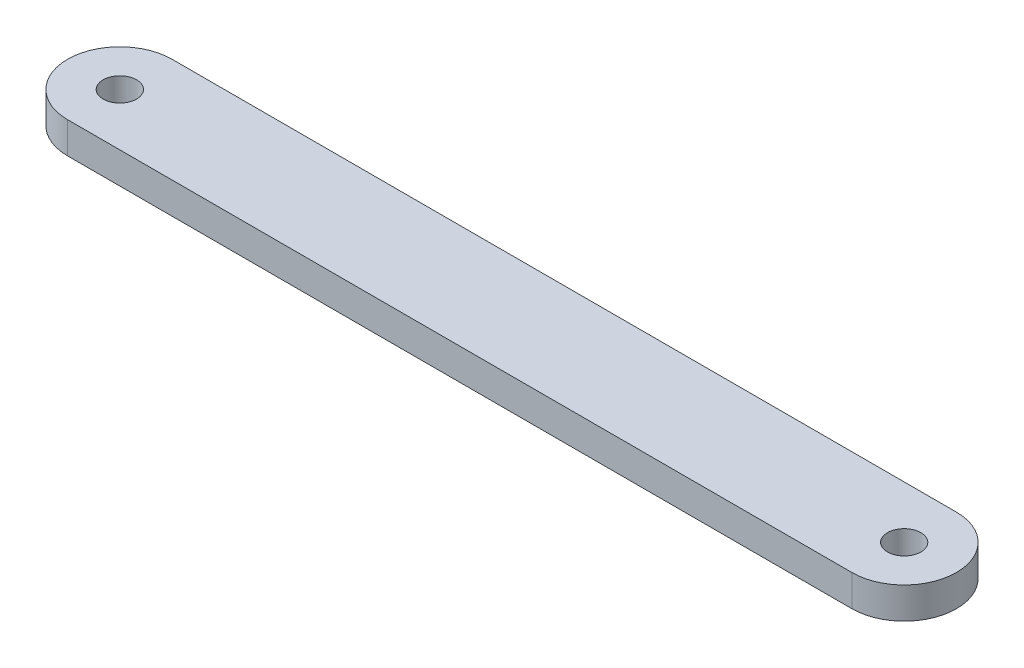
ISO-10303-21;
HEADER;
FILE_DESCRIPTION(('STEP AP214'),'2;1');
FILE_NAME('part.step','',(''),(''),'','','');
FILE_SCHEMA(('AUTOMOTIVE_DESIGN { 1 0 10303 214 1 1 1 1 }'));
ENDSEC;
DATA;
#1=APPLICATION_CONTEXT('core data for automotive mechanical design processes');
#2=APPLICATION_PROTOCOL_DEFINITION('international standard','automotive_design',2000,#1);
#3=PRODUCT_CONTEXT('',#1,'mechanical');
#4=PRODUCT('Part','Part','',(#3));
#5=PRODUCT_RELATED_PRODUCT_CATEGORY('part','',(#4));
#6=PRODUCT_DEFINITION_FORMATION('','',#4);
#7=PRODUCT_DEFINITION_CONTEXT('part definition',#1,'design');
#8=PRODUCT_DEFINITION('design','',#6,#7);
#9=PRODUCT_DEFINITION_SHAPE('','',#8);
#10=(LENGTH_UNIT() NAMED_UNIT(*) SI_UNIT(.MILLI.,.METRE.));
#11=(NAMED_UNIT(*) PLANE_ANGLE_UNIT() SI_UNIT($,.RADIAN.));
#12=(NAMED_UNIT(*) SI_UNIT($,.STERADIAN.) SOLID_ANGLE_UNIT());
#13=UNCERTAINTY_MEASURE_WITH_UNIT(LENGTH_MEASURE(1.E-05),#10,'distance_accuracy_value','');
#14=(GEOMETRIC_REPRESENTATION_CONTEXT(3) GLOBAL_UNCERTAINTY_ASSIGNED_CONTEXT((#13)) GLOBAL_UNIT_ASSIGNED_CONTEXT((#10,
#11,#12)) REPRESENTATION_CONTEXT('',''));
#15=CARTESIAN_POINT('',(0.,0.,0.));
#16=DIRECTION('',(0.,0.,1.));
#17=DIRECTION('',(1.,0.,0.));
#18=AXIS2_PLACEMENT_3D('',#15,#16,#17);
#19=CARTESIAN_POINT('',(75.,3.,0.));
#20=DIRECTION('',(0.,1.,0.));
#21=DIRECTION('',(0.,0.,1.));
#22=AXIS2_PLACEMENT_3D('',#19,#20,#21);
#23=PLANE('',#22);
#24=CARTESIAN_POINT('',(0.,3.,0.));
#25=DIRECTION('',(0.,1.,0.));
#26=DIRECTION('',(0.,0.,1.));
#27=AXIS2_PLACEMENT_3D('',#24,#25,#26);
#28=CIRCLE('',#27,1.6);
#29=CARTESIAN_POINT('',(0.,3.,1.6));
#30=VERTEX_POINT('',#29);
#31=EDGE_CURVE('E112',#30,#30,#28,.T.);
#32=ORIENTED_EDGE('',*,*,#31,.F.);
#33=EDGE_LOOP('',(#32));
#34=FACE_BOUND('',#33,.T.);
#35=CARTESIAN_POINT('',(75.,3.,0.));
#36=DIRECTION('',(0.,1.,0.));
#37=DIRECTION('',(0.,0.,1.));
#38=AXIS2_PLACEMENT_3D('',#35,#36,#37);
#39=CIRCLE('',#38,5.);
#40=CARTESIAN_POINT('',(75.,3.,5.));
#41=VERTEX_POINT('',#40);
#42=CARTESIAN_POINT('',(75.,3.,-5.));
#43=VERTEX_POINT('',#42);
#44=EDGE_CURVE('E92',#41,#43,#39,.T.);
#45=ORIENTED_EDGE('',*,*,#44,.T.);
#46=DIRECTION('',(-1.,0.,0.));
#47=VECTOR('',#46,1.);
#48=CARTESIAN_POINT('',(0.,3.,-5.));
#49=LINE('',#48,#47);
#50=CARTESIAN_POINT('',(0.,3.,-5.));
#51=VERTEX_POINT('',#50);
#52=EDGE_CURVE('E87',#43,#51,#49,.T.);
#53=ORIENTED_EDGE('',*,*,#52,.T.);
#54=CARTESIAN_POINT('',(0.,3.,0.));
#55=DIRECTION('',(0.,1.,0.));
#56=DIRECTION('',(0.,0.,1.));
#57=AXIS2_PLACEMENT_3D('',#54,#55,#56);
#58=CIRCLE('',#57,5.);
#59=CARTESIAN_POINT('',(0.,3.,5.));
#60=VERTEX_POINT('',#59);
#61=EDGE_CURVE('E90',#51,#60,#58,.T.);
#62=ORIENTED_EDGE('',*,*,#61,.T.);
#63=DIRECTION('',(1.,0.,0.));
#64=VECTOR('',#63,1.);
#65=CARTESIAN_POINT('',(0.,3.,5.));
#66=LINE('',#65,#64);
#67=EDGE_CURVE('E57',#60,#41,#66,.T.);
#68=ORIENTED_EDGE('',*,*,#67,.T.);
#69=EDGE_LOOP('',(#45,#53,#62,#68));
#70=FACE_BOUND('',#69,.T.);
#71=CARTESIAN_POINT('',(75.,3.,0.));
#72=DIRECTION('',(0.,1.,0.));
#73=DIRECTION('',(0.,0.,1.));
#74=AXIS2_PLACEMENT_3D('',#71,#72,#73);
#75=CIRCLE('',#74,1.60000000000001);
#76=CARTESIAN_POINT('',(75.,3.,1.60000000000001));
#77=VERTEX_POINT('',#76);
#78=EDGE_CURVE('E134',#77,#77,#75,.T.);
#79=ORIENTED_EDGE('',*,*,#78,.F.);
#80=EDGE_LOOP('',(#79));
#81=FACE_BOUND('',#80,.T.);
#82=ADVANCED_FACE('F39',(#34,#70,#81),#23,.T.);
#83=CARTESIAN_POINT('',(75.,0.,0.));
#84=DIRECTION('',(0.,1.,0.));
#85=DIRECTION('',(0.,0.,1.));
#86=AXIS2_PLACEMENT_3D('',#83,#84,#85);
#87=PLANE('',#86);
#88=CARTESIAN_POINT('',(75.,0.,0.));
#89=DIRECTION('',(0.,1.,0.));
#90=DIRECTION('',(0.,0.,1.));
#91=AXIS2_PLACEMENT_3D('',#88,#89,#90);
#92=CIRCLE('',#91,5.);
#93=CARTESIAN_POINT('',(75.,0.,5.));
#94=VERTEX_POINT('',#93);
#95=CARTESIAN_POINT('',(75.,0.,-5.));
#96=VERTEX_POINT('',#95);
#97=EDGE_CURVE('E108',#94,#96,#92,.T.);
#98=ORIENTED_EDGE('',*,*,#97,.F.);
#99=DIRECTION('',(1.,0.,0.));
#100=VECTOR('',#99,1.);
#101=CARTESIAN_POINT('',(0.,0.,5.));
#102=LINE('',#101,#100);
#103=CARTESIAN_POINT('',(0.,0.,5.));
#104=VERTEX_POINT('',#103);
#105=EDGE_CURVE('E80',#104,#94,#102,.T.);
#106=ORIENTED_EDGE('',*,*,#105,.F.);
#107=CARTESIAN_POINT('',(0.,0.,0.));
#108=DIRECTION('',(0.,1.,0.));
#109=DIRECTION('',(0.,0.,1.));
#110=AXIS2_PLACEMENT_3D('',#107,#108,#109);
#111=CIRCLE('',#110,5.);
#112=CARTESIAN_POINT('',(0.,0.,-5.));
#113=VERTEX_POINT('',#112);
#114=EDGE_CURVE('E74',#113,#104,#111,.T.);
#115=ORIENTED_EDGE('',*,*,#114,.F.);
#116=DIRECTION('',(-1.,0.,0.));
#117=VECTOR('',#116,1.);
#118=CARTESIAN_POINT('',(0.,0.,-5.));
#119=LINE('',#118,#117);
#120=EDGE_CURVE('E97',#96,#113,#119,.T.);
#121=ORIENTED_EDGE('',*,*,#120,.F.);
#122=EDGE_LOOP('',(#98,#106,#115,#121));
#123=FACE_BOUND('',#122,.T.);
#124=CARTESIAN_POINT('',(0.,0.,0.));
#125=DIRECTION('',(0.,1.,0.));
#126=DIRECTION('',(0.,0.,1.));
#127=AXIS2_PLACEMENT_3D('',#124,#125,#126);
#128=CIRCLE('',#127,1.6);
#129=CARTESIAN_POINT('',(0.,0.,1.6));
#130=VERTEX_POINT('',#129);
#131=EDGE_CURVE('E130',#130,#130,#128,.T.);
#132=ORIENTED_EDGE('',*,*,#131,.T.);
#133=EDGE_LOOP('',(#132));
#134=FACE_BOUND('',#133,.T.);
#135=CARTESIAN_POINT('',(75.,0.,0.));
#136=DIRECTION('',(0.,1.,0.));
#137=DIRECTION('',(0.,0.,1.));
#138=AXIS2_PLACEMENT_3D('',#135,#136,#137);
#139=CIRCLE('',#138,1.60000000000001);
#140=CARTESIAN_POINT('',(75.,0.,1.60000000000001));
#141=VERTEX_POINT('',#140);
#142=EDGE_CURVE('E138',#141,#141,#139,.T.);
#143=ORIENTED_EDGE('',*,*,#142,.T.);
#144=EDGE_LOOP('',(#143));
#145=FACE_BOUND('',#144,.T.);
#146=ADVANCED_FACE('F125',(#123,#134,#145),#87,.F.);
#147=CARTESIAN_POINT('',(75.,3.,0.));
#148=DIRECTION('',(0.,-1.,0.));
#149=DIRECTION('',(0.,0.,-1.));
#150=AXIS2_PLACEMENT_3D('',#147,#148,#149);
#151=CYLINDRICAL_SURFACE('',#150,5.);
#152=ORIENTED_EDGE('',*,*,#97,.T.);
#153=DIRECTION('',(0.,-1.,0.));
#154=VECTOR('',#153,1.);
#155=CARTESIAN_POINT('',(75.,3.,-5.));
#156=LINE('',#155,#154);
#157=EDGE_CURVE('E11',#43,#96,#156,.T.);
#158=ORIENTED_EDGE('',*,*,#157,.F.);
#159=ORIENTED_EDGE('',*,*,#44,.F.);
#160=DIRECTION('',(0.,-1.,0.));
#161=VECTOR('',#160,1.);
#162=CARTESIAN_POINT('',(75.,3.,5.));
#163=LINE('',#162,#161);
#164=EDGE_CURVE('E104',#41,#94,#163,.T.);
#165=ORIENTED_EDGE('',*,*,#164,.T.);
#166=EDGE_LOOP('',(#152,#158,#159,#165));
#167=FACE_BOUND('',#166,.T.);
#168=ADVANCED_FACE('F41',(#167),#151,.T.);
#169=CARTESIAN_POINT('',(0.,3.,-5.));
#170=DIRECTION('',(0.,0.,1.));
#171=DIRECTION('',(1.,0.,0.));
#172=AXIS2_PLACEMENT_3D('',#169,#170,#171);
#173=PLANE('',#172);
#174=ORIENTED_EDGE('',*,*,#120,.T.);
#175=DIRECTION('',(0.,-1.,0.));
#176=VECTOR('',#175,1.);
#177=CARTESIAN_POINT('',(0.,3.,-5.));
#178=LINE('',#177,#176);
#179=EDGE_CURVE('E49',#51,#113,#178,.T.);
#180=ORIENTED_EDGE('',*,*,#179,.F.);
#181=ORIENTED_EDGE('',*,*,#52,.F.);
#182=ORIENTED_EDGE('',*,*,#157,.T.);
#183=EDGE_LOOP('',(#174,#180,#181,#182));
#184=FACE_BOUND('',#183,.T.);
#185=ADVANCED_FACE('F96',(#184),#173,.F.);
#186=CARTESIAN_POINT('',(0.,3.,0.));
#187=DIRECTION('',(0.,-1.,0.));
#188=DIRECTION('',(0.,0.,-1.));
#189=AXIS2_PLACEMENT_3D('',#186,#187,#188);
#190=CYLINDRICAL_SURFACE('',#189,5.);
#191=ORIENTED_EDGE('',*,*,#114,.T.);
#192=DIRECTION('',(0.,-1.,0.));
#193=VECTOR('',#192,1.);
#194=CARTESIAN_POINT('',(0.,3.,5.));
#195=LINE('',#194,#193);
#196=EDGE_CURVE('E99',#60,#104,#195,.T.);
#197=ORIENTED_EDGE('',*,*,#196,.F.);
#198=ORIENTED_EDGE('',*,*,#61,.F.);
#199=ORIENTED_EDGE('',*,*,#179,.T.);
#200=EDGE_LOOP('',(#191,#197,#198,#199));
#201=FACE_BOUND('',#200,.T.);
#202=ADVANCED_FACE('F100',(#201),#190,.T.);
#203=CARTESIAN_POINT('',(0.,3.,5.));
#204=DIRECTION('',(0.,0.,-1.));
#205=DIRECTION('',(-1.,0.,0.));
#206=AXIS2_PLACEMENT_3D('',#203,#204,#205);
#207=PLANE('',#206);
#208=ORIENTED_EDGE('',*,*,#105,.T.);
#209=ORIENTED_EDGE('',*,*,#164,.F.);
#210=ORIENTED_EDGE('',*,*,#67,.F.);
#211=ORIENTED_EDGE('',*,*,#196,.T.);
#212=EDGE_LOOP('',(#208,#209,#210,#211));
#213=FACE_BOUND('',#212,.T.);
#214=ADVANCED_FACE('F122',(#213),#207,.F.);
#215=CARTESIAN_POINT('',(0.,3.,0.));
#216=DIRECTION('',(0.,-1.,0.));
#217=DIRECTION('',(0.,0.,-1.));
#218=AXIS2_PLACEMENT_3D('',#215,#216,#217);
#219=CYLINDRICAL_SURFACE('',#218,1.6);
#220=ORIENTED_EDGE('',*,*,#31,.T.);
#221=EDGE_LOOP('',(#220));
#222=FACE_BOUND('',#221,.T.);
#223=ORIENTED_EDGE('',*,*,#131,.F.);
#224=EDGE_LOOP('',(#223));
#225=FACE_BOUND('',#224,.T.);
#226=ADVANCED_FACE('F157',(#222,#225),#219,.F.);
#227=CARTESIAN_POINT('',(75.,3.,0.));
#228=DIRECTION('',(0.,-1.,0.));
#229=DIRECTION('',(0.,0.,-1.));
#230=AXIS2_PLACEMENT_3D('',#227,#228,#229);
#231=CYLINDRICAL_SURFACE('',#230,1.60000000000001);
#232=ORIENTED_EDGE('',*,*,#78,.T.);
#233=EDGE_LOOP('',(#232));
#234=FACE_BOUND('',#233,.T.);
#235=ORIENTED_EDGE('',*,*,#142,.F.);
#236=EDGE_LOOP('',(#235));
#237=FACE_BOUND('',#236,.T.);
#238=ADVANCED_FACE('F146',(#234,#237),#231,.F.);
#239=CLOSED_SHELL('',(#82,#146,#168,#185,#202,#214,#226,#238));
#240=MANIFOLD_SOLID_BREP('B2',#239);
#241=ADVANCED_BREP_SHAPE_REPRESENTATION('',(#18,#240),#14);
#242=SHAPE_DEFINITION_REPRESENTATION(#9,#241);
ENDSEC;
END-ISO-10303-21;
